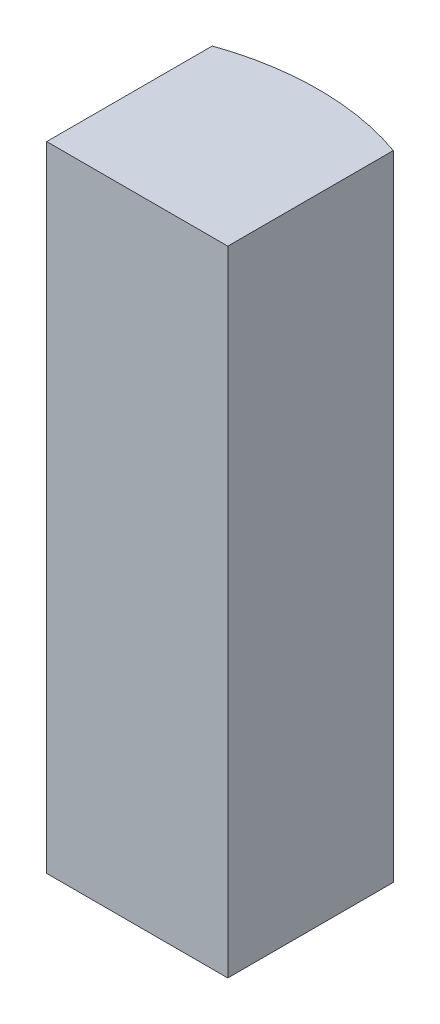
ISO-10303-21;
HEADER;
FILE_DESCRIPTION(('STEP AP214'),'2;1');
FILE_NAME('part.step','',(''),(''),'','','');
FILE_SCHEMA(('AUTOMOTIVE_DESIGN { 1 0 10303 214 1 1 1 1 }'));
ENDSEC;
DATA;
#1=APPLICATION_CONTEXT('core data for automotive mechanical design processes');
#2=APPLICATION_PROTOCOL_DEFINITION('international standard','automotive_design',2000,#1);
#3=PRODUCT_CONTEXT('',#1,'mechanical');
#4=PRODUCT('Part','Part','',(#3));
#5=PRODUCT_RELATED_PRODUCT_CATEGORY('part','',(#4));
#6=PRODUCT_DEFINITION_FORMATION('','',#4);
#7=PRODUCT_DEFINITION_CONTEXT('part definition',#1,'design');
#8=PRODUCT_DEFINITION('design','',#6,#7);
#9=PRODUCT_DEFINITION_SHAPE('','',#8);
#10=(LENGTH_UNIT() NAMED_UNIT(*) SI_UNIT(.MILLI.,.METRE.));
#11=(NAMED_UNIT(*) PLANE_ANGLE_UNIT() SI_UNIT($,.RADIAN.));
#12=(NAMED_UNIT(*) SI_UNIT($,.STERADIAN.) SOLID_ANGLE_UNIT());
#13=UNCERTAINTY_MEASURE_WITH_UNIT(LENGTH_MEASURE(1.E-05),#10,'distance_accuracy_value','');
#14=(GEOMETRIC_REPRESENTATION_CONTEXT(3) GLOBAL_UNCERTAINTY_ASSIGNED_CONTEXT((#13)) GLOBAL_UNIT_ASSIGNED_CONTEXT((#10,
#11,#12)) REPRESENTATION_CONTEXT('',''));
#15=CARTESIAN_POINT('',(0.,0.,0.));
#16=DIRECTION('',(0.,0.,1.));
#17=DIRECTION('',(1.,0.,0.));
#18=AXIS2_PLACEMENT_3D('',#15,#16,#17);
#19=CARTESIAN_POINT('',(20.,140.,0.));
#20=DIRECTION('',(1.,0.,0.));
#21=DIRECTION('',(0.,0.,-1.));
#22=AXIS2_PLACEMENT_3D('',#19,#20,#21);
#23=PLANE('',#22);
#24=DIRECTION('',(0.,0.,1.));
#25=VECTOR('',#24,1.);
#26=CARTESIAN_POINT('',(20.,0.,0.));
#27=LINE('',#26,#25);
#28=CARTESIAN_POINT('',(20.,0.,-56.5685424949238));
#29=VERTEX_POINT('',#28);
#30=CARTESIAN_POINT('',(20.,0.,-20.));
#31=VERTEX_POINT('',#30);
#32=EDGE_CURVE('E99',#29,#31,#27,.T.);
#33=ORIENTED_EDGE('',*,*,#32,.F.);
#34=DIRECTION('',(0.,-1.,0.));
#35=VECTOR('',#34,1.);
#36=CARTESIAN_POINT('',(20.,140.,-56.5685424949238));
#37=LINE('',#36,#35);
#38=CARTESIAN_POINT('',(20.,140.,-56.5685424949238));
#39=VERTEX_POINT('',#38);
#40=EDGE_CURVE('E11',#39,#29,#37,.T.);
#41=ORIENTED_EDGE('',*,*,#40,.F.);
#42=DIRECTION('',(0.,0.,1.));
#43=VECTOR('',#42,1.);
#44=CARTESIAN_POINT('',(20.,140.,0.));
#45=LINE('',#44,#43);
#46=CARTESIAN_POINT('',(20.,140.,-20.));
#47=VERTEX_POINT('',#46);
#48=EDGE_CURVE('E87',#39,#47,#45,.T.);
#49=ORIENTED_EDGE('',*,*,#48,.T.);
#50=DIRECTION('',(0.,-1.,0.));
#51=VECTOR('',#50,1.);
#52=CARTESIAN_POINT('',(20.,140.,-20.));
#53=LINE('',#52,#51);
#54=EDGE_CURVE('E76',#47,#31,#53,.T.);
#55=ORIENTED_EDGE('',*,*,#54,.T.);
#56=EDGE_LOOP('',(#33,#41,#49,#55));
#57=FACE_BOUND('',#56,.T.);
#58=ADVANCED_FACE('F37',(#57),#23,.T.);
#59=CARTESIAN_POINT('',(0.,140.,0.));
#60=DIRECTION('',(0.,-1.,0.));
#61=DIRECTION('',(0.,0.,-1.));
#62=AXIS2_PLACEMENT_3D('',#59,#60,#61);
#63=CYLINDRICAL_SURFACE('',#62,60.);
#64=CARTESIAN_POINT('',(0.,0.,0.));
#65=DIRECTION('',(0.,1.,0.));
#66=DIRECTION('',(0.,0.,1.));
#67=AXIS2_PLACEMENT_3D('',#64,#65,#66);
#68=CIRCLE('',#67,60.);
#69=CARTESIAN_POINT('',(-20.,0.,-56.5685424949238));
#70=VERTEX_POINT('',#69);
#71=EDGE_CURVE('E92',#29,#70,#68,.T.);
#72=ORIENTED_EDGE('',*,*,#71,.T.);
#73=DIRECTION('',(0.,-1.,0.));
#74=VECTOR('',#73,1.);
#75=CARTESIAN_POINT('',(-20.,140.,-56.5685424949238));
#76=LINE('',#75,#74);
#77=CARTESIAN_POINT('',(-20.,140.,-56.5685424949238));
#78=VERTEX_POINT('',#77);
#79=EDGE_CURVE('E45',#78,#70,#76,.T.);
#80=ORIENTED_EDGE('',*,*,#79,.F.);
#81=CARTESIAN_POINT('',(0.,140.,0.));
#82=DIRECTION('',(0.,1.,0.));
#83=DIRECTION('',(0.,0.,1.));
#84=AXIS2_PLACEMENT_3D('',#81,#82,#83);
#85=CIRCLE('',#84,60.);
#86=EDGE_CURVE('E82',#39,#78,#85,.T.);
#87=ORIENTED_EDGE('',*,*,#86,.F.);
#88=ORIENTED_EDGE('',*,*,#40,.T.);
#89=EDGE_LOOP('',(#72,#80,#87,#88));
#90=FACE_BOUND('',#89,.T.);
#91=ADVANCED_FACE('F90',(#90),#63,.T.);
#92=CARTESIAN_POINT('',(-20.,140.,0.));
#93=DIRECTION('',(1.,0.,0.));
#94=DIRECTION('',(0.,0.,-1.));
#95=AXIS2_PLACEMENT_3D('',#92,#93,#94);
#96=PLANE('',#95);
#97=DIRECTION('',(0.,0.,1.));
#98=VECTOR('',#97,1.);
#99=CARTESIAN_POINT('',(-20.,0.,0.));
#100=LINE('',#99,#98);
#101=CARTESIAN_POINT('',(-20.,0.,-20.));
#102=VERTEX_POINT('',#101);
#103=EDGE_CURVE('E69',#70,#102,#100,.T.);
#104=ORIENTED_EDGE('',*,*,#103,.T.);
#105=DIRECTION('',(0.,-1.,0.));
#106=VECTOR('',#105,1.);
#107=CARTESIAN_POINT('',(-20.,140.,-20.));
#108=LINE('',#107,#106);
#109=CARTESIAN_POINT('',(-20.,140.,-20.));
#110=VERTEX_POINT('',#109);
#111=EDGE_CURVE('E93',#110,#102,#108,.T.);
#112=ORIENTED_EDGE('',*,*,#111,.F.);
#113=DIRECTION('',(0.,0.,1.));
#114=VECTOR('',#113,1.);
#115=CARTESIAN_POINT('',(-20.,140.,0.));
#116=LINE('',#115,#114);
#117=EDGE_CURVE('E86',#78,#110,#116,.T.);
#118=ORIENTED_EDGE('',*,*,#117,.F.);
#119=ORIENTED_EDGE('',*,*,#79,.T.);
#120=EDGE_LOOP('',(#104,#112,#118,#119));
#121=FACE_BOUND('',#120,.T.);
#122=ADVANCED_FACE('F94',(#121),#96,.F.);
#123=CARTESIAN_POINT('',(0.,140.,-20.));
#124=DIRECTION('',(0.,0.,-1.));
#125=DIRECTION('',(-1.,0.,0.));
#126=AXIS2_PLACEMENT_3D('',#123,#124,#125);
#127=PLANE('',#126);
#128=DIRECTION('',(1.,0.,0.));
#129=VECTOR('',#128,1.);
#130=CARTESIAN_POINT('',(0.,0.,-20.));
#131=LINE('',#130,#129);
#132=EDGE_CURVE('E104',#102,#31,#131,.T.);
#133=ORIENTED_EDGE('',*,*,#132,.T.);
#134=ORIENTED_EDGE('',*,*,#54,.F.);
#135=DIRECTION('',(1.,0.,0.));
#136=VECTOR('',#135,1.);
#137=CARTESIAN_POINT('',(0.,140.,-20.));
#138=LINE('',#137,#136);
#139=EDGE_CURVE('E53',#110,#47,#138,.T.);
#140=ORIENTED_EDGE('',*,*,#139,.F.);
#141=ORIENTED_EDGE('',*,*,#111,.T.);
#142=EDGE_LOOP('',(#133,#134,#140,#141));
#143=FACE_BOUND('',#142,.T.);
#144=ADVANCED_FACE('F109',(#143),#127,.F.);
#145=CARTESIAN_POINT('',(0.,140.,0.));
#146=DIRECTION('',(0.,1.,0.));
#147=DIRECTION('',(0.,0.,1.));
#148=AXIS2_PLACEMENT_3D('',#145,#146,#147);
#149=PLANE('',#148);
#150=ORIENTED_EDGE('',*,*,#48,.F.);
#151=ORIENTED_EDGE('',*,*,#86,.T.);
#152=ORIENTED_EDGE('',*,*,#117,.T.);
#153=ORIENTED_EDGE('',*,*,#139,.T.);
#154=EDGE_LOOP('',(#150,#151,#152,#153));
#155=FACE_BOUND('',#154,.T.);
#156=ADVANCED_FACE('F84',(#155),#149,.T.);
#157=CARTESIAN_POINT('',(0.,0.,0.));
#158=DIRECTION('',(0.,1.,0.));
#159=DIRECTION('',(0.,0.,1.));
#160=AXIS2_PLACEMENT_3D('',#157,#158,#159);
#161=PLANE('',#160);
#162=ORIENTED_EDGE('',*,*,#32,.T.);
#163=ORIENTED_EDGE('',*,*,#132,.F.);
#164=ORIENTED_EDGE('',*,*,#103,.F.);
#165=ORIENTED_EDGE('',*,*,#71,.F.);
#166=EDGE_LOOP('',(#162,#163,#164,#165));
#167=FACE_BOUND('',#166,.T.);
#168=ADVANCED_FACE('F111',(#167),#161,.F.);
#169=CLOSED_SHELL('',(#58,#91,#122,#144,#156,#168));
#170=MANIFOLD_SOLID_BREP('B2',#169);
#171=ADVANCED_BREP_SHAPE_REPRESENTATION('',(#18,#170),#14);
#172=SHAPE_DEFINITION_REPRESENTATION(#9,#171);
ENDSEC;
END-ISO-10303-21;
